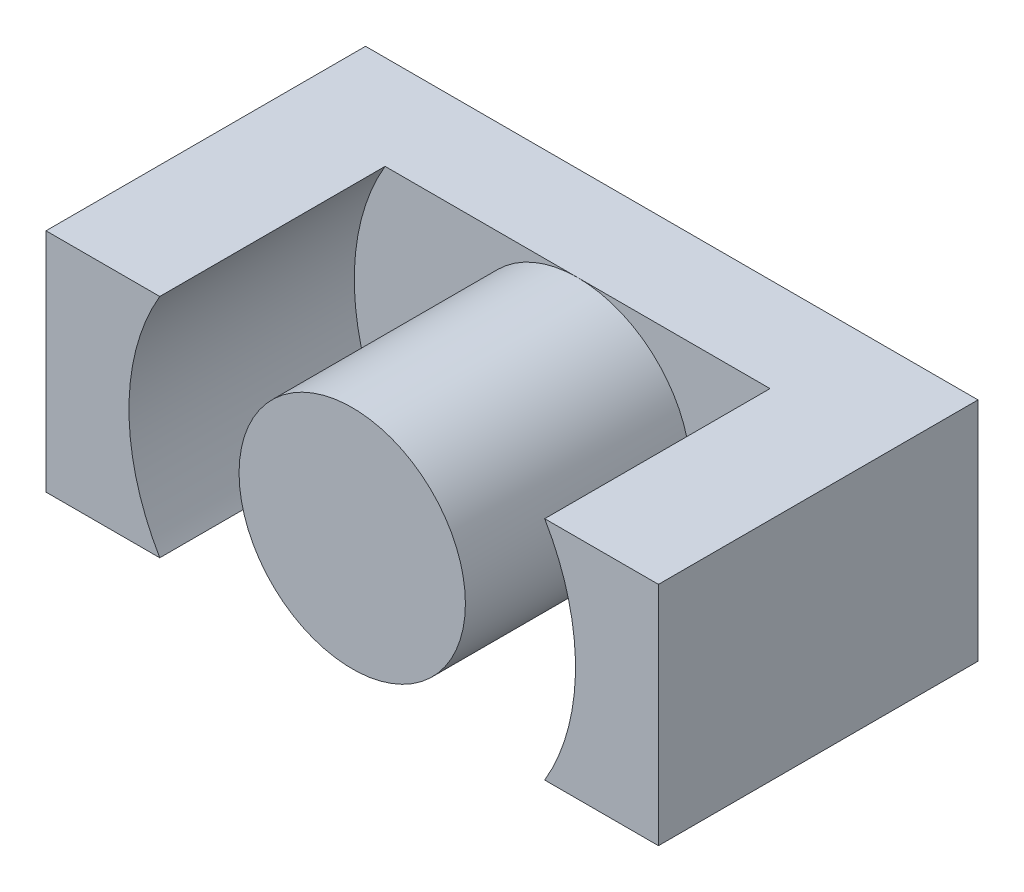
ISO-10303-21;
HEADER;
FILE_DESCRIPTION(('STEP AP214'),'2;1');
FILE_NAME('part.step','',(''),(''),'','','');
FILE_SCHEMA(('AUTOMOTIVE_DESIGN { 1 0 10303 214 1 1 1 1 }'));
ENDSEC;
DATA;
#1=APPLICATION_CONTEXT('core data for automotive mechanical design processes');
#2=APPLICATION_PROTOCOL_DEFINITION('international standard','automotive_design',2000,#1);
#3=PRODUCT_CONTEXT('',#1,'mechanical');
#4=PRODUCT('Part','Part','',(#3));
#5=PRODUCT_RELATED_PRODUCT_CATEGORY('part','',(#4));
#6=PRODUCT_DEFINITION_FORMATION('','',#4);
#7=PRODUCT_DEFINITION_CONTEXT('part definition',#1,'design');
#8=PRODUCT_DEFINITION('design','',#6,#7);
#9=PRODUCT_DEFINITION_SHAPE('','',#8);
#10=(LENGTH_UNIT() NAMED_UNIT(*) SI_UNIT(.MILLI.,.METRE.));
#11=(NAMED_UNIT(*) PLANE_ANGLE_UNIT() SI_UNIT($,.RADIAN.));
#12=(NAMED_UNIT(*) SI_UNIT($,.STERADIAN.) SOLID_ANGLE_UNIT());
#13=UNCERTAINTY_MEASURE_WITH_UNIT(LENGTH_MEASURE(1.E-05),#10,'distance_accuracy_value','');
#14=(GEOMETRIC_REPRESENTATION_CONTEXT(3) GLOBAL_UNCERTAINTY_ASSIGNED_CONTEXT((#13)) GLOBAL_UNIT_ASSIGNED_CONTEXT((#10,
#11,#12)) REPRESENTATION_CONTEXT('',''));
#15=CARTESIAN_POINT('',(0.,0.,0.));
#16=DIRECTION('',(0.,0.,1.));
#17=DIRECTION('',(1.,0.,0.));
#18=AXIS2_PLACEMENT_3D('',#15,#16,#17);
#19=CARTESIAN_POINT('',(0.,0.,31.2));
#20=DIRECTION('',(0.,0.,1.));
#21=DIRECTION('',(1.,0.,0.));
#22=AXIS2_PLACEMENT_3D('',#19,#20,#21);
#23=PLANE('',#22);
#24=DIRECTION('',(0.,1.,0.));
#25=VECTOR('',#24,1.);
#26=CARTESIAN_POINT('',(-29.9,11.05,31.2));
#27=LINE('',#26,#25);
#28=CARTESIAN_POINT('',(-29.9,-11.05,31.2));
#29=VERTEX_POINT('',#28);
#30=CARTESIAN_POINT('',(-29.9,11.05,31.2));
#31=VERTEX_POINT('',#30);
#32=EDGE_CURVE('E77',#29,#31,#27,.T.);
#33=ORIENTED_EDGE('',*,*,#32,.F.);
#34=DIRECTION('',(1.,0.,0.));
#35=VECTOR('',#34,1.);
#36=CARTESIAN_POINT('',(-29.9,-11.05,31.2));
#37=LINE('',#36,#35);
#38=CARTESIAN_POINT('',(-18.7919530650755,-11.05,31.2));
#39=VERTEX_POINT('',#38);
#40=EDGE_CURVE('E103',#39,#29,#37,.F.);
#41=ORIENTED_EDGE('',*,*,#40,.F.);
#42=CARTESIAN_POINT('',(0.,0.,31.2));
#43=DIRECTION('',(0.,0.,-1.));
#44=DIRECTION('',(-1.,0.,0.));
#45=AXIS2_PLACEMENT_3D('',#42,#43,#44);
#46=CIRCLE('',#45,21.8);
#47=CARTESIAN_POINT('',(-18.7919530650755,11.05,31.2));
#48=VERTEX_POINT('',#47);
#49=EDGE_CURVE('E21',#39,#48,#46,.T.);
#50=ORIENTED_EDGE('',*,*,#49,.T.);
#51=DIRECTION('',(1.,0.,0.));
#52=VECTOR('',#51,1.);
#53=CARTESIAN_POINT('',(29.9,11.05,31.2));
#54=LINE('',#53,#52);
#55=EDGE_CURVE('E100',#31,#48,#54,.T.);
#56=ORIENTED_EDGE('',*,*,#55,.F.);
#57=EDGE_LOOP('',(#33,#41,#50,#56));
#58=FACE_BOUND('',#57,.T.);
#59=ADVANCED_FACE('F18',(#58),#23,.T.);
#60=CARTESIAN_POINT('',(-29.9,11.05,0.));
#61=DIRECTION('',(-1.,0.,0.));
#62=DIRECTION('',(0.,0.,1.));
#63=AXIS2_PLACEMENT_3D('',#60,#61,#62);
#64=PLANE('',#63);
#65=ORIENTED_EDGE('',*,*,#32,.T.);
#66=DIRECTION('',(0.,0.,1.));
#67=VECTOR('',#66,1.);
#68=CARTESIAN_POINT('',(-29.9,11.05,0.));
#69=LINE('',#68,#67);
#70=CARTESIAN_POINT('',(-29.9,11.05,0.));
#71=VERTEX_POINT('',#70);
#72=EDGE_CURVE('E118',#71,#31,#69,.T.);
#73=ORIENTED_EDGE('',*,*,#72,.F.);
#74=DIRECTION('',(0.,1.,0.));
#75=VECTOR('',#74,1.);
#76=CARTESIAN_POINT('',(-29.9,0.,0.));
#77=LINE('',#76,#75);
#78=CARTESIAN_POINT('',(-29.9,-11.05,0.));
#79=VERTEX_POINT('',#78);
#80=EDGE_CURVE('E194',#71,#79,#77,.F.);
#81=ORIENTED_EDGE('',*,*,#80,.T.);
#82=DIRECTION('',(0.,0.,-1.));
#83=VECTOR('',#82,1.);
#84=CARTESIAN_POINT('',(-29.9,-11.05,0.));
#85=LINE('',#84,#83);
#86=EDGE_CURVE('E200',#29,#79,#85,.T.);
#87=ORIENTED_EDGE('',*,*,#86,.F.);
#88=EDGE_LOOP('',(#65,#73,#81,#87));
#89=FACE_BOUND('',#88,.T.);
#90=ADVANCED_FACE('F259',(#89),#64,.T.);
#91=CARTESIAN_POINT('',(0.,0.,0.));
#92=DIRECTION('',(0.,0.,1.));
#93=DIRECTION('',(1.,0.,0.));
#94=AXIS2_PLACEMENT_3D('',#91,#92,#93);
#95=PLANE('',#94);
#96=ORIENTED_EDGE('',*,*,#80,.F.);
#97=DIRECTION('',(1.,0.,0.));
#98=VECTOR('',#97,1.);
#99=CARTESIAN_POINT('',(29.9,11.05,0.));
#100=LINE('',#99,#98);
#101=CARTESIAN_POINT('',(29.9,11.05,0.));
#102=VERTEX_POINT('',#101);
#103=EDGE_CURVE('E126',#102,#71,#100,.F.);
#104=ORIENTED_EDGE('',*,*,#103,.F.);
#105=DIRECTION('',(0.,1.,0.));
#106=VECTOR('',#105,1.);
#107=CARTESIAN_POINT('',(29.9,-11.05,0.));
#108=LINE('',#107,#106);
#109=CARTESIAN_POINT('',(29.9,-11.05,0.));
#110=VERTEX_POINT('',#109);
#111=EDGE_CURVE('E182',#110,#102,#108,.T.);
#112=ORIENTED_EDGE('',*,*,#111,.F.);
#113=DIRECTION('',(1.,0.,0.));
#114=VECTOR('',#113,1.);
#115=CARTESIAN_POINT('',(-29.9,-11.05,0.));
#116=LINE('',#115,#114);
#117=EDGE_CURVE('E189',#79,#110,#116,.T.);
#118=ORIENTED_EDGE('',*,*,#117,.F.);
#119=EDGE_LOOP('',(#96,#104,#112,#118));
#120=FACE_BOUND('',#119,.T.);
#121=ADVANCED_FACE('F257',(#120),#95,.F.);
#122=CARTESIAN_POINT('',(29.9,-11.05,0.));
#123=DIRECTION('',(1.,0.,0.));
#124=DIRECTION('',(0.,0.,-1.));
#125=AXIS2_PLACEMENT_3D('',#122,#123,#124);
#126=PLANE('',#125);
#127=DIRECTION('',(0.,1.,0.));
#128=VECTOR('',#127,1.);
#129=CARTESIAN_POINT('',(29.9,0.,31.2));
#130=LINE('',#129,#128);
#131=CARTESIAN_POINT('',(29.9,-11.05,31.2));
#132=VERTEX_POINT('',#131);
#133=CARTESIAN_POINT('',(29.9,11.05,31.2));
#134=VERTEX_POINT('',#133);
#135=EDGE_CURVE('E96',#132,#134,#130,.T.);
#136=ORIENTED_EDGE('',*,*,#135,.F.);
#137=DIRECTION('',(0.,0.,-1.));
#138=VECTOR('',#137,1.);
#139=CARTESIAN_POINT('',(29.9,-11.05,0.));
#140=LINE('',#139,#138);
#141=EDGE_CURVE('E178',#110,#132,#140,.F.);
#142=ORIENTED_EDGE('',*,*,#141,.F.);
#143=ORIENTED_EDGE('',*,*,#111,.T.);
#144=DIRECTION('',(0.,0.,1.));
#145=VECTOR('',#144,1.);
#146=CARTESIAN_POINT('',(29.9,11.05,0.));
#147=LINE('',#146,#145);
#148=EDGE_CURVE('E171',#134,#102,#147,.F.);
#149=ORIENTED_EDGE('',*,*,#148,.F.);
#150=EDGE_LOOP('',(#136,#142,#143,#149));
#151=FACE_BOUND('',#150,.T.);
#152=ADVANCED_FACE('F265',(#151),#126,.T.);
#153=CARTESIAN_POINT('',(0.,0.,31.2));
#154=DIRECTION('',(0.,0.,1.));
#155=DIRECTION('',(1.,0.,0.));
#156=AXIS2_PLACEMENT_3D('',#153,#154,#155);
#157=PLANE('',#156);
#158=ORIENTED_EDGE('',*,*,#135,.T.);
#159=DIRECTION('',(1.,0.,0.));
#160=VECTOR('',#159,1.);
#161=CARTESIAN_POINT('',(29.9,11.05,31.2));
#162=LINE('',#161,#160);
#163=CARTESIAN_POINT('',(18.7919530650755,11.05,31.2));
#164=VERTEX_POINT('',#163);
#165=EDGE_CURVE('E114',#164,#134,#162,.T.);
#166=ORIENTED_EDGE('',*,*,#165,.F.);
#167=CARTESIAN_POINT('',(0.,0.,31.2));
#168=DIRECTION('',(0.,0.,-1.));
#169=DIRECTION('',(-1.,0.,0.));
#170=AXIS2_PLACEMENT_3D('',#167,#168,#169);
#171=CIRCLE('',#170,21.8);
#172=CARTESIAN_POINT('',(18.7919530650755,-11.05,31.2));
#173=VERTEX_POINT('',#172);
#174=EDGE_CURVE('E164',#164,#173,#171,.T.);
#175=ORIENTED_EDGE('',*,*,#174,.T.);
#176=DIRECTION('',(1.,0.,0.));
#177=VECTOR('',#176,1.);
#178=CARTESIAN_POINT('',(-29.9,-11.05,31.2));
#179=LINE('',#178,#177);
#180=EDGE_CURVE('E174',#132,#173,#179,.F.);
#181=ORIENTED_EDGE('',*,*,#180,.F.);
#182=EDGE_LOOP('',(#158,#166,#175,#181));
#183=FACE_BOUND('',#182,.T.);
#184=ADVANCED_FACE('F228',(#183),#157,.T.);
#185=CARTESIAN_POINT('',(0.,0.,31.2));
#186=DIRECTION('',(0.,0.,-1.));
#187=DIRECTION('',(-1.,0.,0.));
#188=AXIS2_PLACEMENT_3D('',#185,#186,#187);
#189=CYLINDRICAL_SURFACE('',#188,21.8);
#190=ORIENTED_EDGE('',*,*,#49,.F.);
#191=DIRECTION('',(0.,0.,-1.));
#192=VECTOR('',#191,1.);
#193=CARTESIAN_POINT('',(-18.7919530650755,-11.05,0.));
#194=LINE('',#193,#192);
#195=CARTESIAN_POINT('',(-18.7919530650755,-11.05,9.2));
#196=VERTEX_POINT('',#195);
#197=EDGE_CURVE('E120',#196,#39,#194,.F.);
#198=ORIENTED_EDGE('',*,*,#197,.F.);
#199=CARTESIAN_POINT('',(0.,0.,9.2));
#200=DIRECTION('',(0.,0.,-1.));
#201=DIRECTION('',(-1.,0.,0.));
#202=AXIS2_PLACEMENT_3D('',#199,#200,#201);
#203=CIRCLE('',#202,21.8);
#204=CARTESIAN_POINT('',(-18.7919530650755,11.05,9.2));
#205=VERTEX_POINT('',#204);
#206=EDGE_CURVE('E110',#205,#196,#203,.F.);
#207=ORIENTED_EDGE('',*,*,#206,.F.);
#208=DIRECTION('',(0.,0.,1.));
#209=VECTOR('',#208,1.);
#210=CARTESIAN_POINT('',(-18.7919530650755,11.05,0.));
#211=LINE('',#210,#209);
#212=EDGE_CURVE('E106',#48,#205,#211,.F.);
#213=ORIENTED_EDGE('',*,*,#212,.F.);
#214=EDGE_LOOP('',(#190,#198,#207,#213));
#215=FACE_BOUND('',#214,.T.);
#216=ADVANCED_FACE('F108',(#215),#189,.F.);
#217=CARTESIAN_POINT('',(29.9,11.05,0.));
#218=DIRECTION('',(0.,1.,0.));
#219=DIRECTION('',(0.,0.,1.));
#220=AXIS2_PLACEMENT_3D('',#217,#218,#219);
#221=PLANE('',#220);
#222=ORIENTED_EDGE('',*,*,#72,.T.);
#223=ORIENTED_EDGE('',*,*,#55,.T.);
#224=ORIENTED_EDGE('',*,*,#212,.T.);
#225=DIRECTION('',(1.,0.,0.));
#226=VECTOR('',#225,1.);
#227=CARTESIAN_POINT('',(0.,11.05,9.2));
#228=LINE('',#227,#226);
#229=CARTESIAN_POINT('',(0.,11.05,9.2));
#230=VERTEX_POINT('',#229);
#231=EDGE_CURVE('E157',#230,#205,#228,.F.);
#232=ORIENTED_EDGE('',*,*,#231,.F.);
#233=DIRECTION('',(1.,0.,0.));
#234=VECTOR('',#233,1.);
#235=CARTESIAN_POINT('',(0.,11.05,9.2));
#236=LINE('',#235,#234);
#237=CARTESIAN_POINT('',(18.7919530650755,11.05,9.2));
#238=VERTEX_POINT('',#237);
#239=EDGE_CURVE('E150',#238,#230,#236,.F.);
#240=ORIENTED_EDGE('',*,*,#239,.F.);
#241=DIRECTION('',(0.,0.,-1.));
#242=VECTOR('',#241,1.);
#243=CARTESIAN_POINT('',(18.7919530650755,11.05,31.2));
#244=LINE('',#243,#242);
#245=EDGE_CURVE('E160',#238,#164,#244,.F.);
#246=ORIENTED_EDGE('',*,*,#245,.T.);
#247=ORIENTED_EDGE('',*,*,#165,.T.);
#248=ORIENTED_EDGE('',*,*,#148,.T.);
#249=ORIENTED_EDGE('',*,*,#103,.T.);
#250=EDGE_LOOP('',(#222,#223,#224,#232,#240,#246,#247,#248,#249));
#251=FACE_BOUND('',#250,.T.);
#252=ADVANCED_FACE('F116',(#251),#221,.T.);
#253=CARTESIAN_POINT('',(-29.9,-11.05,0.));
#254=DIRECTION('',(0.,-1.,0.));
#255=DIRECTION('',(0.,0.,-1.));
#256=AXIS2_PLACEMENT_3D('',#253,#254,#255);
#257=PLANE('',#256);
#258=DIRECTION('',(1.,0.,0.));
#259=VECTOR('',#258,1.);
#260=CARTESIAN_POINT('',(0.,-11.05,9.2));
#261=LINE('',#260,#259);
#262=CARTESIAN_POINT('',(0.,-11.05,9.2));
#263=VERTEX_POINT('',#262);
#264=CARTESIAN_POINT('',(18.7919530650755,-11.05,9.2));
#265=VERTEX_POINT('',#264);
#266=EDGE_CURVE('E38',#263,#265,#261,.T.);
#267=ORIENTED_EDGE('',*,*,#266,.F.);
#268=DIRECTION('',(1.,0.,0.));
#269=VECTOR('',#268,1.);
#270=CARTESIAN_POINT('',(0.,-11.05,9.2));
#271=LINE('',#270,#269);
#272=EDGE_CURVE('E153',#196,#263,#271,.T.);
#273=ORIENTED_EDGE('',*,*,#272,.F.);
#274=ORIENTED_EDGE('',*,*,#197,.T.);
#275=ORIENTED_EDGE('',*,*,#40,.T.);
#276=ORIENTED_EDGE('',*,*,#86,.T.);
#277=ORIENTED_EDGE('',*,*,#117,.T.);
#278=ORIENTED_EDGE('',*,*,#141,.T.);
#279=ORIENTED_EDGE('',*,*,#180,.T.);
#280=DIRECTION('',(0.,0.,-1.));
#281=VECTOR('',#280,1.);
#282=CARTESIAN_POINT('',(18.7919530650755,-11.05,31.2));
#283=LINE('',#282,#281);
#284=EDGE_CURVE('E161',#173,#265,#283,.T.);
#285=ORIENTED_EDGE('',*,*,#284,.T.);
#286=EDGE_LOOP('',(#267,#273,#274,#275,#276,#277,#278,#279,#285));
#287=FACE_BOUND('',#286,.T.);
#288=ADVANCED_FACE('F217',(#287),#257,.T.);
#289=CARTESIAN_POINT('',(0.,0.,31.2));
#290=DIRECTION('',(0.,0.,-1.));
#291=DIRECTION('',(-1.,0.,0.));
#292=AXIS2_PLACEMENT_3D('',#289,#290,#291);
#293=CYLINDRICAL_SURFACE('',#292,21.8);
#294=CARTESIAN_POINT('',(0.,0.,9.2));
#295=DIRECTION('',(0.,0.,-1.));
#296=DIRECTION('',(-1.,0.,0.));
#297=AXIS2_PLACEMENT_3D('',#294,#295,#296);
#298=CIRCLE('',#297,21.8);
#299=EDGE_CURVE('E149',#265,#238,#298,.F.);
#300=ORIENTED_EDGE('',*,*,#299,.F.);
#301=ORIENTED_EDGE('',*,*,#284,.F.);
#302=ORIENTED_EDGE('',*,*,#174,.F.);
#303=ORIENTED_EDGE('',*,*,#245,.F.);
#304=EDGE_LOOP('',(#300,#301,#302,#303));
#305=FACE_BOUND('',#304,.T.);
#306=ADVANCED_FACE('F234',(#305),#293,.F.);
#307=CARTESIAN_POINT('',(0.,0.,9.2));
#308=DIRECTION('',(0.,0.,1.));
#309=DIRECTION('',(1.,0.,0.));
#310=AXIS2_PLACEMENT_3D('',#307,#308,#309);
#311=PLANE('',#310);
#312=ORIENTED_EDGE('',*,*,#272,.T.);
#313=CARTESIAN_POINT('',(0.,0.,9.2));
#314=DIRECTION('',(0.,0.,-1.));
#315=DIRECTION('',(-1.,0.,0.));
#316=AXIS2_PLACEMENT_3D('',#313,#314,#315);
#317=CIRCLE('',#316,11.05);
#318=EDGE_CURVE('E238',#230,#263,#317,.F.);
#319=ORIENTED_EDGE('',*,*,#318,.F.);
#320=ORIENTED_EDGE('',*,*,#231,.T.);
#321=ORIENTED_EDGE('',*,*,#206,.T.);
#322=EDGE_LOOP('',(#312,#319,#320,#321));
#323=FACE_BOUND('',#322,.T.);
#324=ADVANCED_FACE('F221',(#323),#311,.T.);
#325=CARTESIAN_POINT('',(0.,0.,9.2));
#326=DIRECTION('',(0.,0.,1.));
#327=DIRECTION('',(1.,0.,0.));
#328=AXIS2_PLACEMENT_3D('',#325,#326,#327);
#329=PLANE('',#328);
#330=ORIENTED_EDGE('',*,*,#266,.T.);
#331=ORIENTED_EDGE('',*,*,#299,.T.);
#332=ORIENTED_EDGE('',*,*,#239,.T.);
#333=CARTESIAN_POINT('',(0.,0.,9.2));
#334=DIRECTION('',(0.,0.,-1.));
#335=DIRECTION('',(-1.,0.,0.));
#336=AXIS2_PLACEMENT_3D('',#333,#334,#335);
#337=CIRCLE('',#336,11.05);
#338=EDGE_CURVE('E29',#263,#230,#337,.F.);
#339=ORIENTED_EDGE('',*,*,#338,.F.);
#340=EDGE_LOOP('',(#330,#331,#332,#339));
#341=FACE_BOUND('',#340,.T.);
#342=ADVANCED_FACE('F239',(#341),#329,.T.);
#343=CARTESIAN_POINT('',(0.,0.,31.2));
#344=DIRECTION('',(0.,0.,1.));
#345=DIRECTION('',(1.,0.,0.));
#346=AXIS2_PLACEMENT_3D('',#343,#344,#345);
#347=PLANE('',#346);
#348=CARTESIAN_POINT('',(0.,0.,31.2));
#349=DIRECTION('',(0.,0.,-1.));
#350=DIRECTION('',(-1.,0.,0.));
#351=AXIS2_PLACEMENT_3D('',#348,#349,#350);
#352=CIRCLE('',#351,11.05);
#353=CARTESIAN_POINT('',(-11.05,0.,31.2));
#354=VERTEX_POINT('',#353);
#355=EDGE_CURVE('E12',#354,#354,#352,.T.);
#356=ORIENTED_EDGE('',*,*,#355,.F.);
#357=EDGE_LOOP('',(#356));
#358=FACE_BOUND('',#357,.T.);
#359=ADVANCED_FACE('F268',(#358),#347,.T.);
#360=CARTESIAN_POINT('',(0.,0.,31.2));
#361=DIRECTION('',(0.,0.,-1.));
#362=DIRECTION('',(-1.,0.,0.));
#363=AXIS2_PLACEMENT_3D('',#360,#361,#362);
#364=CYLINDRICAL_SURFACE('',#363,11.05);
#365=ORIENTED_EDGE('',*,*,#355,.T.);
#366=EDGE_LOOP('',(#365));
#367=FACE_BOUND('',#366,.T.);
#368=ORIENTED_EDGE('',*,*,#318,.T.);
#369=ORIENTED_EDGE('',*,*,#338,.T.);
#370=EDGE_LOOP('',(#368,#369));
#371=FACE_BOUND('',#370,.T.);
#372=ADVANCED_FACE('F245',(#367,#371),#364,.T.);
#373=CLOSED_SHELL('',(#59,#90,#121,#152,#184,#216,#252,#288,#306,#324,#342,#359,#372));
#374=MANIFOLD_SOLID_BREP('B1',#373);
#375=ADVANCED_BREP_SHAPE_REPRESENTATION('',(#18,#374),#14);
#376=SHAPE_DEFINITION_REPRESENTATION(#9,#375);
ENDSEC;
END-ISO-10303-21;
